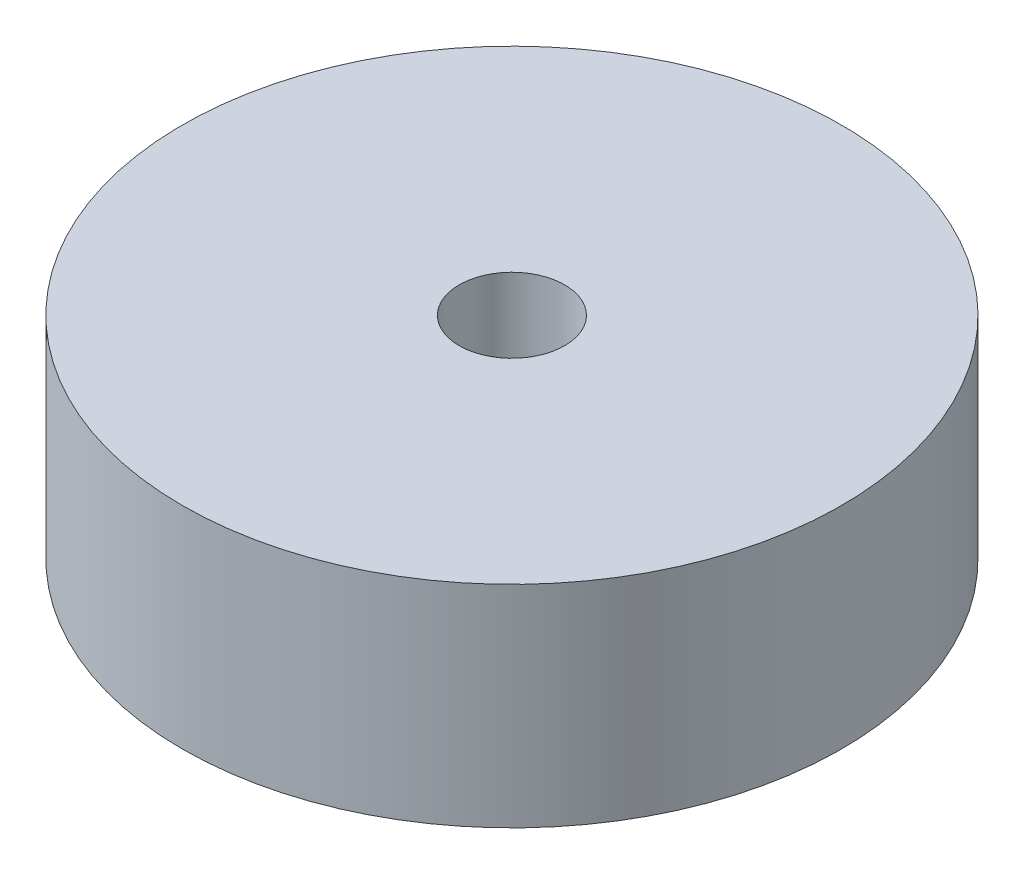
ISO-10303-21;
HEADER;
FILE_DESCRIPTION(('STEP AP214'),'2;1');
FILE_NAME('part.step','',(''),(''),'','','');
FILE_SCHEMA(('AUTOMOTIVE_DESIGN { 1 0 10303 214 1 1 1 1 }'));
ENDSEC;
DATA;
#1=APPLICATION_CONTEXT('core data for automotive mechanical design processes');
#2=APPLICATION_PROTOCOL_DEFINITION('international standard','automotive_design',2000,#1);
#3=PRODUCT_CONTEXT('',#1,'mechanical');
#4=PRODUCT('Part','Part','',(#3));
#5=PRODUCT_RELATED_PRODUCT_CATEGORY('part','',(#4));
#6=PRODUCT_DEFINITION_FORMATION('','',#4);
#7=PRODUCT_DEFINITION_CONTEXT('part definition',#1,'design');
#8=PRODUCT_DEFINITION('design','',#6,#7);
#9=PRODUCT_DEFINITION_SHAPE('','',#8);
#10=(LENGTH_UNIT() NAMED_UNIT(*) SI_UNIT(.MILLI.,.METRE.));
#11=(NAMED_UNIT(*) PLANE_ANGLE_UNIT() SI_UNIT($,.RADIAN.));
#12=(NAMED_UNIT(*) SI_UNIT($,.STERADIAN.) SOLID_ANGLE_UNIT());
#13=UNCERTAINTY_MEASURE_WITH_UNIT(LENGTH_MEASURE(1.E-05),#10,'distance_accuracy_value','');
#14=(GEOMETRIC_REPRESENTATION_CONTEXT(3) GLOBAL_UNCERTAINTY_ASSIGNED_CONTEXT((#13)) GLOBAL_UNIT_ASSIGNED_CONTEXT((#10,
#11,#12)) REPRESENTATION_CONTEXT('',''));
#15=CARTESIAN_POINT('',(0.,0.,0.));
#16=DIRECTION('',(0.,0.,1.));
#17=DIRECTION('',(1.,0.,0.));
#18=AXIS2_PLACEMENT_3D('',#15,#16,#17);
#19=CARTESIAN_POINT('',(0.,16.,0.));
#20=DIRECTION('',(0.,1.,0.));
#21=DIRECTION('',(0.,0.,1.));
#22=AXIS2_PLACEMENT_3D('',#19,#20,#21);
#23=PLANE('',#22);
#24=CARTESIAN_POINT('',(0.,16.,0.));
#25=DIRECTION('',(0.,1.,0.));
#26=DIRECTION('',(0.,0.,1.));
#27=AXIS2_PLACEMENT_3D('',#24,#25,#26);
#28=CIRCLE('',#27,25.);
#29=CARTESIAN_POINT('',(0.,16.,25.));
#30=VERTEX_POINT('',#29);
#31=EDGE_CURVE('E10',#30,#30,#28,.T.);
#32=ORIENTED_EDGE('',*,*,#31,.T.);
#33=EDGE_LOOP('',(#32));
#34=FACE_BOUND('',#33,.T.);
#35=CARTESIAN_POINT('',(0.,16.,0.));
#36=DIRECTION('',(0.,1.,0.));
#37=DIRECTION('',(0.,0.,1.));
#38=AXIS2_PLACEMENT_3D('',#35,#36,#37);
#39=CIRCLE('',#38,4.);
#40=CARTESIAN_POINT('',(0.,16.,4.));
#41=VERTEX_POINT('',#40);
#42=EDGE_CURVE('E57',#41,#41,#39,.T.);
#43=ORIENTED_EDGE('',*,*,#42,.F.);
#44=EDGE_LOOP('',(#43));
#45=FACE_BOUND('',#44,.T.);
#46=ADVANCED_FACE('F43',(#34,#45),#23,.T.);
#47=CARTESIAN_POINT('',(0.,0.,0.));
#48=DIRECTION('',(0.,1.,0.));
#49=DIRECTION('',(0.,0.,1.));
#50=AXIS2_PLACEMENT_3D('',#47,#48,#49);
#51=PLANE('',#50);
#52=CARTESIAN_POINT('',(0.,0.,0.));
#53=DIRECTION('',(0.,1.,0.));
#54=DIRECTION('',(0.,0.,1.));
#55=AXIS2_PLACEMENT_3D('',#52,#53,#54);
#56=CIRCLE('',#55,25.);
#57=CARTESIAN_POINT('',(0.,0.,25.));
#58=VERTEX_POINT('',#57);
#59=EDGE_CURVE('E50',#58,#58,#56,.T.);
#60=ORIENTED_EDGE('',*,*,#59,.F.);
#61=EDGE_LOOP('',(#60));
#62=FACE_BOUND('',#61,.T.);
#63=CARTESIAN_POINT('',(0.,0.,0.));
#64=DIRECTION('',(0.,1.,0.));
#65=DIRECTION('',(0.,0.,1.));
#66=AXIS2_PLACEMENT_3D('',#63,#64,#65);
#67=CIRCLE('',#66,4.);
#68=CARTESIAN_POINT('',(0.,0.,4.));
#69=VERTEX_POINT('',#68);
#70=EDGE_CURVE('E59',#69,#69,#67,.T.);
#71=ORIENTED_EDGE('',*,*,#70,.T.);
#72=EDGE_LOOP('',(#71));
#73=FACE_BOUND('',#72,.T.);
#74=ADVANCED_FACE('F67',(#62,#73),#51,.F.);
#75=CARTESIAN_POINT('',(0.,16.,0.));
#76=DIRECTION('',(0.,-1.,0.));
#77=DIRECTION('',(0.,0.,-1.));
#78=AXIS2_PLACEMENT_3D('',#75,#76,#77);
#79=CYLINDRICAL_SURFACE('',#78,25.);
#80=ORIENTED_EDGE('',*,*,#31,.F.);
#81=EDGE_LOOP('',(#80));
#82=FACE_BOUND('',#81,.T.);
#83=ORIENTED_EDGE('',*,*,#59,.T.);
#84=EDGE_LOOP('',(#83));
#85=FACE_BOUND('',#84,.T.);
#86=ADVANCED_FACE('F44',(#82,#85),#79,.T.);
#87=CARTESIAN_POINT('',(0.,16.,0.));
#88=DIRECTION('',(0.,-1.,0.));
#89=DIRECTION('',(0.,0.,-1.));
#90=AXIS2_PLACEMENT_3D('',#87,#88,#89);
#91=CYLINDRICAL_SURFACE('',#90,4.);
#92=ORIENTED_EDGE('',*,*,#42,.T.);
#93=EDGE_LOOP('',(#92));
#94=FACE_BOUND('',#93,.T.);
#95=ORIENTED_EDGE('',*,*,#70,.F.);
#96=EDGE_LOOP('',(#95));
#97=FACE_BOUND('',#96,.T.);
#98=ADVANCED_FACE('F69',(#94,#97),#91,.F.);
#99=CLOSED_SHELL('',(#46,#74,#86,#98));
#100=MANIFOLD_SOLID_BREP('B2',#99);
#101=ADVANCED_BREP_SHAPE_REPRESENTATION('',(#18,#100),#14);
#102=SHAPE_DEFINITION_REPRESENTATION(#9,#101);
ENDSEC;
END-ISO-10303-21;
